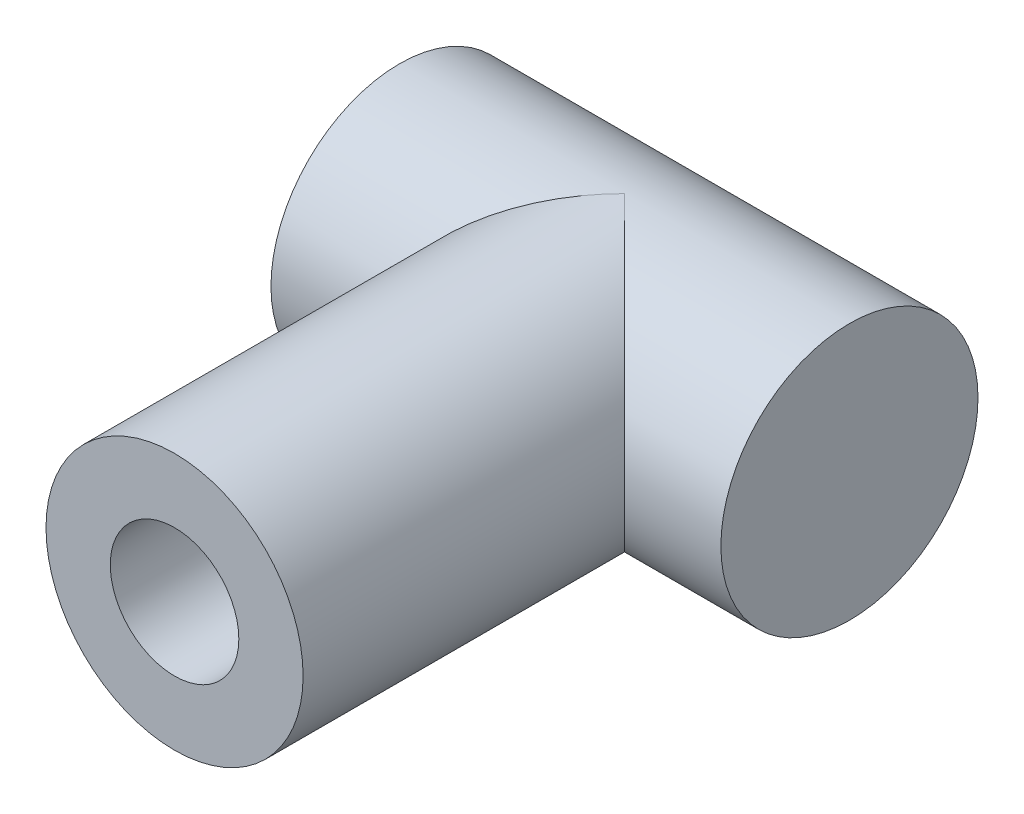
ISO-10303-21;
HEADER;
FILE_DESCRIPTION(('STEP AP214'),'2;1');
FILE_NAME('part.step','',(''),(''),'','','');
FILE_SCHEMA(('AUTOMOTIVE_DESIGN { 1 0 10303 214 1 1 1 1 }'));
ENDSEC;
DATA;
#1=APPLICATION_CONTEXT('core data for automotive mechanical design processes');
#2=APPLICATION_PROTOCOL_DEFINITION('international standard','automotive_design',2000,#1);
#3=PRODUCT_CONTEXT('',#1,'mechanical');
#4=PRODUCT('Part','Part','',(#3));
#5=PRODUCT_RELATED_PRODUCT_CATEGORY('part','',(#4));
#6=PRODUCT_DEFINITION_FORMATION('','',#4);
#7=PRODUCT_DEFINITION_CONTEXT('part definition',#1,'design');
#8=PRODUCT_DEFINITION('design','',#6,#7);
#9=PRODUCT_DEFINITION_SHAPE('','',#8);
#10=(LENGTH_UNIT() NAMED_UNIT(*) SI_UNIT(.MILLI.,.METRE.));
#11=(NAMED_UNIT(*) PLANE_ANGLE_UNIT() SI_UNIT($,.RADIAN.));
#12=(NAMED_UNIT(*) SI_UNIT($,.STERADIAN.) SOLID_ANGLE_UNIT());
#13=UNCERTAINTY_MEASURE_WITH_UNIT(LENGTH_MEASURE(1.E-05),#10,'distance_accuracy_value','');
#14=(GEOMETRIC_REPRESENTATION_CONTEXT(3) GLOBAL_UNCERTAINTY_ASSIGNED_CONTEXT((#13)) GLOBAL_UNIT_ASSIGNED_CONTEXT((#10,
#11,#12)) REPRESENTATION_CONTEXT('',''));
#15=CARTESIAN_POINT('',(0.,0.,0.));
#16=DIRECTION('',(0.,0.,1.));
#17=DIRECTION('',(1.,0.,0.));
#18=AXIS2_PLACEMENT_3D('',#15,#16,#17);
#19=CARTESIAN_POINT('',(17.5,0.,0.));
#20=DIRECTION('',(-1.,0.,0.));
#21=DIRECTION('',(0.,0.,1.));
#22=AXIS2_PLACEMENT_3D('',#19,#20,#21);
#23=CYLINDRICAL_SURFACE('',#22,10.);
#24=CARTESIAN_POINT('',(-17.5,0.,0.));
#25=DIRECTION('',(1.,0.,0.));
#26=DIRECTION('',(0.,0.,-1.));
#27=AXIS2_PLACEMENT_3D('',#24,#25,#26);
#28=CIRCLE('',#27,10.);
#29=CARTESIAN_POINT('',(-17.5,0.,-10.));
#30=VERTEX_POINT('',#29);
#31=EDGE_CURVE('E52',#30,#30,#28,.T.);
#32=ORIENTED_EDGE('',*,*,#31,.T.);
#33=EDGE_LOOP('',(#32));
#34=FACE_BOUND('',#33,.T.);
#35=CARTESIAN_POINT('',(17.5,0.,0.));
#36=DIRECTION('',(1.,0.,0.));
#37=DIRECTION('',(0.,0.,-1.));
#38=AXIS2_PLACEMENT_3D('',#35,#36,#37);
#39=CIRCLE('',#38,10.);
#40=CARTESIAN_POINT('',(17.5,0.,-10.));
#41=VERTEX_POINT('',#40);
#42=EDGE_CURVE('E50',#41,#41,#39,.T.);
#43=ORIENTED_EDGE('',*,*,#42,.F.);
#44=EDGE_LOOP('',(#43));
#45=FACE_BOUND('',#44,.T.);
#46=CARTESIAN_POINT('',(0.,0.,0.));
#47=DIRECTION('',(-0.707106781186547,0.,-0.707106781186547));
#48=DIRECTION('',(-0.707106781186547,0.,0.707106781186547));
#49=AXIS2_PLACEMENT_3D('',#46,#47,#48);
#50=ELLIPSE('',#49,14.142135623731,10.);
#51=CARTESIAN_POINT('',(0.,10.,0.));
#52=VERTEX_POINT('',#51);
#53=CARTESIAN_POINT('',(0.,-10.,0.));
#54=VERTEX_POINT('',#53);
#55=EDGE_CURVE('E11',#52,#54,#50,.F.);
#56=ORIENTED_EDGE('',*,*,#55,.F.);
#57=CARTESIAN_POINT('',(0.,0.,0.));
#58=DIRECTION('',(-0.707106781186547,0.,0.707106781186547));
#59=DIRECTION('',(-0.707106781186547,0.,-0.707106781186547));
#60=AXIS2_PLACEMENT_3D('',#57,#58,#59);
#61=ELLIPSE('',#60,14.142135623731,10.);
#62=EDGE_CURVE('E42',#54,#52,#61,.T.);
#63=ORIENTED_EDGE('',*,*,#62,.F.);
#64=EDGE_LOOP('',(#56,#63));
#65=FACE_BOUND('',#64,.T.);
#66=ADVANCED_FACE('F35',(#34,#45,#65),#23,.T.);
#67=CARTESIAN_POINT('',(17.5,0.,0.));
#68=DIRECTION('',(1.,0.,0.));
#69=DIRECTION('',(0.,0.,-1.));
#70=AXIS2_PLACEMENT_3D('',#67,#68,#69);
#71=PLANE('',#70);
#72=ORIENTED_EDGE('',*,*,#42,.T.);
#73=EDGE_LOOP('',(#72));
#74=FACE_BOUND('',#73,.T.);
#75=ADVANCED_FACE('F87',(#74),#71,.T.);
#76=CARTESIAN_POINT('',(-17.5,0.,0.));
#77=DIRECTION('',(1.,0.,0.));
#78=DIRECTION('',(0.,0.,-1.));
#79=AXIS2_PLACEMENT_3D('',#76,#77,#78);
#80=PLANE('',#79);
#81=ORIENTED_EDGE('',*,*,#31,.F.);
#82=EDGE_LOOP('',(#81));
#83=FACE_BOUND('',#82,.T.);
#84=ADVANCED_FACE('F82',(#83),#80,.F.);
#85=CARTESIAN_POINT('',(0.,0.,35.));
#86=DIRECTION('',(0.,0.,-1.));
#87=DIRECTION('',(-1.,0.,0.));
#88=AXIS2_PLACEMENT_3D('',#85,#86,#87);
#89=CYLINDRICAL_SURFACE('',#88,10.);
#90=CARTESIAN_POINT('',(0.,0.,35.));
#91=DIRECTION('',(0.,0.,1.));
#92=DIRECTION('',(1.,0.,0.));
#93=AXIS2_PLACEMENT_3D('',#90,#91,#92);
#94=CIRCLE('',#93,10.);
#95=CARTESIAN_POINT('',(10.,0.,35.));
#96=VERTEX_POINT('',#95);
#97=EDGE_CURVE('E56',#96,#96,#94,.T.);
#98=ORIENTED_EDGE('',*,*,#97,.F.);
#99=EDGE_LOOP('',(#98));
#100=FACE_BOUND('',#99,.T.);
#101=ORIENTED_EDGE('',*,*,#62,.T.);
#102=ORIENTED_EDGE('',*,*,#55,.T.);
#103=EDGE_LOOP('',(#101,#102));
#104=FACE_BOUND('',#103,.T.);
#105=ADVANCED_FACE('F49',(#100,#104),#89,.T.);
#106=CARTESIAN_POINT('',(0.,0.,35.));
#107=DIRECTION('',(0.,0.,1.));
#108=DIRECTION('',(1.,0.,0.));
#109=AXIS2_PLACEMENT_3D('',#106,#107,#108);
#110=PLANE('',#109);
#111=CARTESIAN_POINT('',(0.,0.,35.));
#112=DIRECTION('',(0.,0.,1.));
#113=DIRECTION('',(1.,0.,0.));
#114=AXIS2_PLACEMENT_3D('',#111,#112,#113);
#115=CIRCLE('',#114,5.);
#116=CARTESIAN_POINT('',(5.,0.,35.));
#117=VERTEX_POINT('',#116);
#118=EDGE_CURVE('E61',#117,#117,#115,.T.);
#119=ORIENTED_EDGE('',*,*,#118,.F.);
#120=EDGE_LOOP('',(#119));
#121=FACE_BOUND('',#120,.T.);
#122=ORIENTED_EDGE('',*,*,#97,.T.);
#123=EDGE_LOOP('',(#122));
#124=FACE_BOUND('',#123,.T.);
#125=ADVANCED_FACE('F72',(#121,#124),#110,.T.);
#126=CARTESIAN_POINT('',(0.,0.,23.));
#127=DIRECTION('',(0.,0.,1.));
#128=DIRECTION('',(1.,0.,0.));
#129=AXIS2_PLACEMENT_3D('',#126,#127,#128);
#130=CYLINDRICAL_SURFACE('',#129,5.);
#131=CARTESIAN_POINT('',(0.,0.,23.));
#132=DIRECTION('',(0.,0.,1.));
#133=DIRECTION('',(1.,0.,0.));
#134=AXIS2_PLACEMENT_3D('',#131,#132,#133);
#135=CIRCLE('',#134,5.);
#136=CARTESIAN_POINT('',(5.,0.,23.));
#137=VERTEX_POINT('',#136);
#138=EDGE_CURVE('E60',#137,#137,#135,.T.);
#139=ORIENTED_EDGE('',*,*,#138,.F.);
#140=EDGE_LOOP('',(#139));
#141=FACE_BOUND('',#140,.T.);
#142=ORIENTED_EDGE('',*,*,#118,.T.);
#143=EDGE_LOOP('',(#142));
#144=FACE_BOUND('',#143,.T.);
#145=ADVANCED_FACE('F69',(#141,#144),#130,.F.);
#146=CARTESIAN_POINT('',(0.,0.,23.));
#147=DIRECTION('',(0.,0.,1.));
#148=DIRECTION('',(1.,0.,0.));
#149=AXIS2_PLACEMENT_3D('',#146,#147,#148);
#150=PLANE('',#149);
#151=ORIENTED_EDGE('',*,*,#138,.T.);
#152=EDGE_LOOP('',(#151));
#153=FACE_BOUND('',#152,.T.);
#154=ADVANCED_FACE('F67',(#153),#150,.T.);
#155=CLOSED_SHELL('',(#66,#75,#84,#105,#125,#145,#154));
#156=MANIFOLD_SOLID_BREP('B2',#155);
#157=ADVANCED_BREP_SHAPE_REPRESENTATION('',(#18,#156),#14);
#158=SHAPE_DEFINITION_REPRESENTATION(#9,#157);
ENDSEC;
END-ISO-10303-21;
